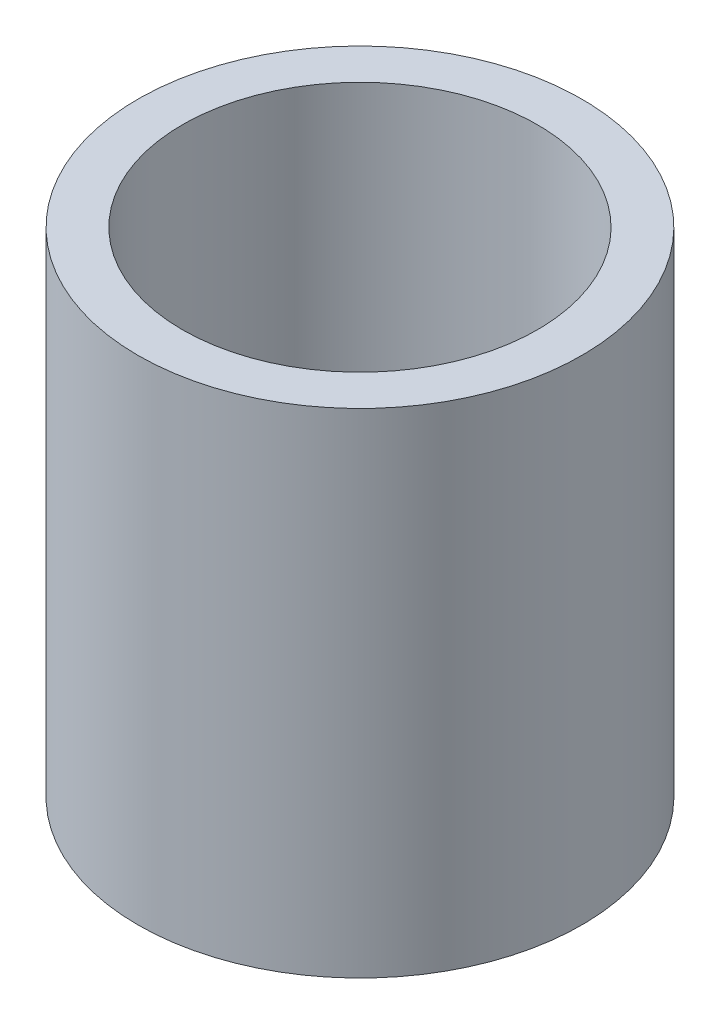
ISO-10303-21;
HEADER;
FILE_DESCRIPTION(('STEP AP214'),'2;1');
FILE_NAME('part.step','',(''),(''),'','','');
FILE_SCHEMA(('AUTOMOTIVE_DESIGN { 1 0 10303 214 1 1 1 1 }'));
ENDSEC;
DATA;
#1=APPLICATION_CONTEXT('core data for automotive mechanical design processes');
#2=APPLICATION_PROTOCOL_DEFINITION('international standard','automotive_design',2000,#1);
#3=PRODUCT_CONTEXT('',#1,'mechanical');
#4=PRODUCT('Part','Part','',(#3));
#5=PRODUCT_RELATED_PRODUCT_CATEGORY('part','',(#4));
#6=PRODUCT_DEFINITION_FORMATION('','',#4);
#7=PRODUCT_DEFINITION_CONTEXT('part definition',#1,'design');
#8=PRODUCT_DEFINITION('design','',#6,#7);
#9=PRODUCT_DEFINITION_SHAPE('','',#8);
#10=(LENGTH_UNIT() NAMED_UNIT(*) SI_UNIT(.MILLI.,.METRE.));
#11=(NAMED_UNIT(*) PLANE_ANGLE_UNIT() SI_UNIT($,.RADIAN.));
#12=(NAMED_UNIT(*) SI_UNIT($,.STERADIAN.) SOLID_ANGLE_UNIT());
#13=UNCERTAINTY_MEASURE_WITH_UNIT(LENGTH_MEASURE(1.E-05),#10,'distance_accuracy_value','');
#14=(GEOMETRIC_REPRESENTATION_CONTEXT(3) GLOBAL_UNCERTAINTY_ASSIGNED_CONTEXT((#13)) GLOBAL_UNIT_ASSIGNED_CONTEXT((#10,
#11,#12)) REPRESENTATION_CONTEXT('',''));
#15=CARTESIAN_POINT('',(0.,0.,0.));
#16=DIRECTION('',(0.,0.,1.));
#17=DIRECTION('',(1.,0.,0.));
#18=AXIS2_PLACEMENT_3D('',#15,#16,#17);
#19=CARTESIAN_POINT('',(0.,5.,0.));
#20=DIRECTION('',(0.,1.,0.));
#21=DIRECTION('',(0.,0.,1.));
#22=AXIS2_PLACEMENT_3D('',#19,#20,#21);
#23=PLANE('',#22);
#24=CARTESIAN_POINT('',(0.,5.,0.));
#25=DIRECTION('',(0.,1.,0.));
#26=DIRECTION('',(0.,0.,1.));
#27=AXIS2_PLACEMENT_3D('',#24,#25,#26);
#28=CIRCLE('',#27,2.25);
#29=CARTESIAN_POINT('',(0.,5.,2.25));
#30=VERTEX_POINT('',#29);
#31=EDGE_CURVE('E10',#30,#30,#28,.T.);
#32=ORIENTED_EDGE('',*,*,#31,.T.);
#33=EDGE_LOOP('',(#32));
#34=FACE_BOUND('',#33,.T.);
#35=CARTESIAN_POINT('',(0.,5.,0.));
#36=DIRECTION('',(0.,1.,0.));
#37=DIRECTION('',(0.,0.,1.));
#38=AXIS2_PLACEMENT_3D('',#35,#36,#37);
#39=CIRCLE('',#38,1.8);
#40=CARTESIAN_POINT('',(0.,5.,1.8));
#41=VERTEX_POINT('',#40);
#42=EDGE_CURVE('E50',#41,#41,#39,.T.);
#43=ORIENTED_EDGE('',*,*,#42,.F.);
#44=EDGE_LOOP('',(#43));
#45=FACE_BOUND('',#44,.T.);
#46=ADVANCED_FACE('F39',(#34,#45),#23,.T.);
#47=CARTESIAN_POINT('',(0.,0.,0.));
#48=DIRECTION('',(0.,1.,0.));
#49=DIRECTION('',(0.,0.,1.));
#50=AXIS2_PLACEMENT_3D('',#47,#48,#49);
#51=PLANE('',#50);
#52=CARTESIAN_POINT('',(0.,0.,0.));
#53=DIRECTION('',(0.,1.,0.));
#54=DIRECTION('',(0.,0.,1.));
#55=AXIS2_PLACEMENT_3D('',#52,#53,#54);
#56=CIRCLE('',#55,2.25);
#57=CARTESIAN_POINT('',(0.,0.,2.25));
#58=VERTEX_POINT('',#57);
#59=EDGE_CURVE('E43',#58,#58,#56,.T.);
#60=ORIENTED_EDGE('',*,*,#59,.F.);
#61=EDGE_LOOP('',(#60));
#62=FACE_BOUND('',#61,.T.);
#63=CARTESIAN_POINT('',(0.,0.,0.));
#64=DIRECTION('',(0.,1.,0.));
#65=DIRECTION('',(0.,0.,1.));
#66=AXIS2_PLACEMENT_3D('',#63,#64,#65);
#67=CIRCLE('',#66,1.8);
#68=CARTESIAN_POINT('',(0.,0.,1.8));
#69=VERTEX_POINT('',#68);
#70=EDGE_CURVE('E52',#69,#69,#67,.T.);
#71=ORIENTED_EDGE('',*,*,#70,.T.);
#72=EDGE_LOOP('',(#71));
#73=FACE_BOUND('',#72,.T.);
#74=ADVANCED_FACE('F62',(#62,#73),#51,.F.);
#75=CARTESIAN_POINT('',(0.,5.,0.));
#76=DIRECTION('',(0.,-1.,0.));
#77=DIRECTION('',(0.,0.,-1.));
#78=AXIS2_PLACEMENT_3D('',#75,#76,#77);
#79=CYLINDRICAL_SURFACE('',#78,2.25);
#80=ORIENTED_EDGE('',*,*,#31,.F.);
#81=EDGE_LOOP('',(#80));
#82=FACE_BOUND('',#81,.T.);
#83=ORIENTED_EDGE('',*,*,#59,.T.);
#84=EDGE_LOOP('',(#83));
#85=FACE_BOUND('',#84,.T.);
#86=ADVANCED_FACE('F41',(#82,#85),#79,.T.);
#87=CARTESIAN_POINT('',(0.,5.,0.));
#88=DIRECTION('',(0.,-1.,0.));
#89=DIRECTION('',(0.,0.,-1.));
#90=AXIS2_PLACEMENT_3D('',#87,#88,#89);
#91=CYLINDRICAL_SURFACE('',#90,1.8);
#92=ORIENTED_EDGE('',*,*,#42,.T.);
#93=EDGE_LOOP('',(#92));
#94=FACE_BOUND('',#93,.T.);
#95=ORIENTED_EDGE('',*,*,#70,.F.);
#96=EDGE_LOOP('',(#95));
#97=FACE_BOUND('',#96,.T.);
#98=ADVANCED_FACE('F58',(#94,#97),#91,.F.);
#99=CLOSED_SHELL('',(#46,#74,#86,#98));
#100=MANIFOLD_SOLID_BREP('B2',#99);
#101=ADVANCED_BREP_SHAPE_REPRESENTATION('',(#18,#100),#14);
#102=SHAPE_DEFINITION_REPRESENTATION(#9,#101);
ENDSEC;
END-ISO-10303-21;
